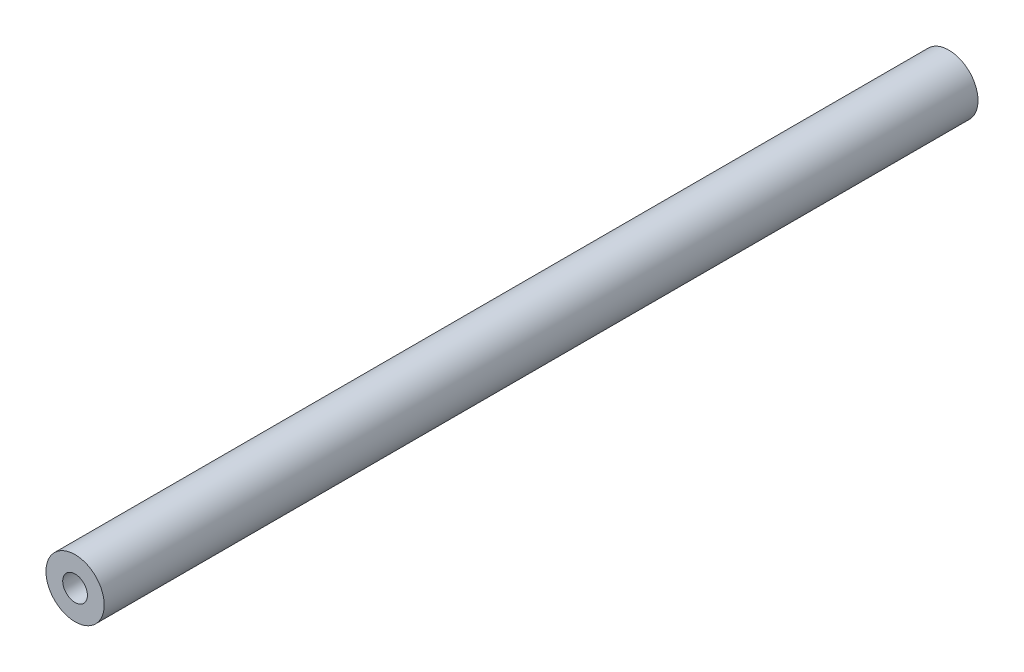
ISO-10303-21;
HEADER;
FILE_DESCRIPTION(('STEP AP214'),'2;1');
FILE_NAME('part.step','',(''),(''),'','','');
FILE_SCHEMA(('AUTOMOTIVE_DESIGN { 1 0 10303 214 1 1 1 1 }'));
ENDSEC;
DATA;
#1=APPLICATION_CONTEXT('core data for automotive mechanical design processes');
#2=APPLICATION_PROTOCOL_DEFINITION('international standard','automotive_design',2000,#1);
#3=PRODUCT_CONTEXT('',#1,'mechanical');
#4=PRODUCT('Part','Part','',(#3));
#5=PRODUCT_RELATED_PRODUCT_CATEGORY('part','',(#4));
#6=PRODUCT_DEFINITION_FORMATION('','',#4);
#7=PRODUCT_DEFINITION_CONTEXT('part definition',#1,'design');
#8=PRODUCT_DEFINITION('design','',#6,#7);
#9=PRODUCT_DEFINITION_SHAPE('','',#8);
#10=(LENGTH_UNIT() NAMED_UNIT(*) SI_UNIT(.MILLI.,.METRE.));
#11=(NAMED_UNIT(*) PLANE_ANGLE_UNIT() SI_UNIT($,.RADIAN.));
#12=(NAMED_UNIT(*) SI_UNIT($,.STERADIAN.) SOLID_ANGLE_UNIT());
#13=UNCERTAINTY_MEASURE_WITH_UNIT(LENGTH_MEASURE(1.E-05),#10,'distance_accuracy_value','');
#14=(GEOMETRIC_REPRESENTATION_CONTEXT(3) GLOBAL_UNCERTAINTY_ASSIGNED_CONTEXT((#13)) GLOBAL_UNIT_ASSIGNED_CONTEXT((#10,
#11,#12)) REPRESENTATION_CONTEXT('',''));
#15=CARTESIAN_POINT('',(0.,0.,0.));
#16=DIRECTION('',(0.,0.,1.));
#17=DIRECTION('',(1.,0.,0.));
#18=AXIS2_PLACEMENT_3D('',#15,#16,#17);
#19=CARTESIAN_POINT('',(0.,0.,71.4375));
#20=DIRECTION('',(0.,0.,-1.));
#21=DIRECTION('',(-1.,0.,0.));
#22=AXIS2_PLACEMENT_3D('',#19,#20,#21);
#23=CYLINDRICAL_SURFACE('',#22,4.7625);
#24=CARTESIAN_POINT('',(0.,0.,71.4375));
#25=DIRECTION('',(0.,0.,1.));
#26=DIRECTION('',(1.,0.,0.));
#27=AXIS2_PLACEMENT_3D('',#24,#25,#26);
#28=CIRCLE('',#27,4.7625);
#29=CARTESIAN_POINT('',(4.7625,0.,71.4375));
#30=VERTEX_POINT('',#29);
#31=EDGE_CURVE('E11',#30,#30,#28,.T.);
#32=ORIENTED_EDGE('',*,*,#31,.F.);
#33=EDGE_LOOP('',(#32));
#34=FACE_BOUND('',#33,.T.);
#35=CARTESIAN_POINT('',(0.,0.,-71.4375));
#36=DIRECTION('',(0.,0.,1.));
#37=DIRECTION('',(1.,0.,0.));
#38=AXIS2_PLACEMENT_3D('',#35,#36,#37);
#39=CIRCLE('',#38,4.7625);
#40=CARTESIAN_POINT('',(4.7625,0.,-71.4375));
#41=VERTEX_POINT('',#40);
#42=EDGE_CURVE('E44',#41,#41,#39,.T.);
#43=ORIENTED_EDGE('',*,*,#42,.T.);
#44=EDGE_LOOP('',(#43));
#45=FACE_BOUND('',#44,.T.);
#46=ADVANCED_FACE('F41',(#34,#45),#23,.T.);
#47=CARTESIAN_POINT('',(0.,0.,71.4375));
#48=DIRECTION('',(0.,0.,1.));
#49=DIRECTION('',(1.,0.,0.));
#50=AXIS2_PLACEMENT_3D('',#47,#48,#49);
#51=PLANE('',#50);
#52=CARTESIAN_POINT('',(0.,0.,71.4375));
#53=DIRECTION('',(0.,0.,1.));
#54=DIRECTION('',(1.,0.,0.));
#55=AXIS2_PLACEMENT_3D('',#52,#53,#54);
#56=CIRCLE('',#55,2.01929999999999);
#57=CARTESIAN_POINT('',(2.01929999999999,0.,71.4375));
#58=VERTEX_POINT('',#57);
#59=EDGE_CURVE('E65',#58,#58,#56,.T.);
#60=ORIENTED_EDGE('',*,*,#59,.F.);
#61=EDGE_LOOP('',(#60));
#62=FACE_BOUND('',#61,.T.);
#63=ORIENTED_EDGE('',*,*,#31,.T.);
#64=EDGE_LOOP('',(#63));
#65=FACE_BOUND('',#64,.T.);
#66=ADVANCED_FACE('F83',(#62,#65),#51,.T.);
#67=CARTESIAN_POINT('',(0.,0.,-71.4375));
#68=DIRECTION('',(0.,0.,1.));
#69=DIRECTION('',(1.,0.,0.));
#70=AXIS2_PLACEMENT_3D('',#67,#68,#69);
#71=PLANE('',#70);
#72=CARTESIAN_POINT('',(0.,0.,-71.4375));
#73=DIRECTION('',(0.,0.,-1.));
#74=DIRECTION('',(-1.,0.,0.));
#75=AXIS2_PLACEMENT_3D('',#72,#73,#74);
#76=CIRCLE('',#75,2.01929999999999);
#77=CARTESIAN_POINT('',(-2.01929999999999,0.,-71.4375));
#78=VERTEX_POINT('',#77);
#79=EDGE_CURVE('E64',#78,#78,#76,.T.);
#80=ORIENTED_EDGE('',*,*,#79,.F.);
#81=EDGE_LOOP('',(#80));
#82=FACE_BOUND('',#81,.T.);
#83=ORIENTED_EDGE('',*,*,#42,.F.);
#84=EDGE_LOOP('',(#83));
#85=FACE_BOUND('',#84,.T.);
#86=ADVANCED_FACE('F80',(#82,#85),#71,.F.);
#87=CARTESIAN_POINT('',(0.,0.,-59.4995));
#88=DIRECTION('',(0.,0.,-1.));
#89=DIRECTION('',(-1.,0.,0.));
#90=AXIS2_PLACEMENT_3D('',#87,#88,#89);
#91=CONICAL_SURFACE('',#90,2.01929999999999,1.02974425867665);
#92=CARTESIAN_POINT('',(0.,0.,-58.2861821519977));
#93=VERTEX_POINT('',#92);
#94=VERTEX_LOOP('',#93);
#95=FACE_BOUND('',#94,.T.);
#96=CARTESIAN_POINT('',(0.,0.,-59.4995));
#97=DIRECTION('',(0.,0.,-1.));
#98=DIRECTION('',(-1.,0.,0.));
#99=AXIS2_PLACEMENT_3D('',#96,#97,#98);
#100=CIRCLE('',#99,2.01929999999999);
#101=CARTESIAN_POINT('',(-2.01929999999999,0.,-59.4995));
#102=VERTEX_POINT('',#101);
#103=EDGE_CURVE('E68',#102,#102,#100,.T.);
#104=ORIENTED_EDGE('',*,*,#103,.T.);
#105=EDGE_LOOP('',(#104));
#106=FACE_BOUND('',#105,.T.);
#107=ADVANCED_FACE('F82',(#95,#106),#91,.F.);
#108=CARTESIAN_POINT('',(0.,0.,-71.4375));
#109=DIRECTION('',(0.,0.,-1.));
#110=DIRECTION('',(-1.,0.,0.));
#111=AXIS2_PLACEMENT_3D('',#108,#109,#110);
#112=CYLINDRICAL_SURFACE('',#111,2.01929999999999);
#113=ORIENTED_EDGE('',*,*,#103,.F.);
#114=EDGE_LOOP('',(#113));
#115=FACE_BOUND('',#114,.T.);
#116=ORIENTED_EDGE('',*,*,#79,.T.);
#117=EDGE_LOOP('',(#116));
#118=FACE_BOUND('',#117,.T.);
#119=ADVANCED_FACE('F58',(#115,#118),#112,.F.);
#120=CARTESIAN_POINT('',(0.,0.,59.4995));
#121=DIRECTION('',(0.,0.,1.));
#122=DIRECTION('',(1.,0.,0.));
#123=AXIS2_PLACEMENT_3D('',#120,#121,#122);
#124=CONICAL_SURFACE('',#123,2.01929999999999,1.02974425867665);
#125=CARTESIAN_POINT('',(0.,0.,58.2861821519977));
#126=VERTEX_POINT('',#125);
#127=VERTEX_LOOP('',#126);
#128=FACE_BOUND('',#127,.T.);
#129=CARTESIAN_POINT('',(0.,0.,59.4995));
#130=DIRECTION('',(0.,0.,1.));
#131=DIRECTION('',(1.,0.,0.));
#132=AXIS2_PLACEMENT_3D('',#129,#130,#131);
#133=CIRCLE('',#132,2.01929999999999);
#134=CARTESIAN_POINT('',(2.01929999999999,0.,59.4995));
#135=VERTEX_POINT('',#134);
#136=EDGE_CURVE('E62',#135,#135,#133,.T.);
#137=ORIENTED_EDGE('',*,*,#136,.T.);
#138=EDGE_LOOP('',(#137));
#139=FACE_BOUND('',#138,.T.);
#140=ADVANCED_FACE('F54',(#128,#139),#124,.F.);
#141=CARTESIAN_POINT('',(0.,0.,71.4375));
#142=DIRECTION('',(0.,0.,1.));
#143=DIRECTION('',(1.,0.,0.));
#144=AXIS2_PLACEMENT_3D('',#141,#142,#143);
#145=CYLINDRICAL_SURFACE('',#144,2.01929999999999);
#146=ORIENTED_EDGE('',*,*,#136,.F.);
#147=EDGE_LOOP('',(#146));
#148=FACE_BOUND('',#147,.T.);
#149=ORIENTED_EDGE('',*,*,#59,.T.);
#150=EDGE_LOOP('',(#149));
#151=FACE_BOUND('',#150,.T.);
#152=ADVANCED_FACE('F57',(#148,#151),#145,.F.);
#153=CLOSED_SHELL('',(#46,#66,#86,#107,#119,#140,#152));
#154=MANIFOLD_SOLID_BREP('B2',#153);
#155=ADVANCED_BREP_SHAPE_REPRESENTATION('',(#18,#154),#14);
#156=SHAPE_DEFINITION_REPRESENTATION(#9,#155);
ENDSEC;
END-ISO-10303-21;
